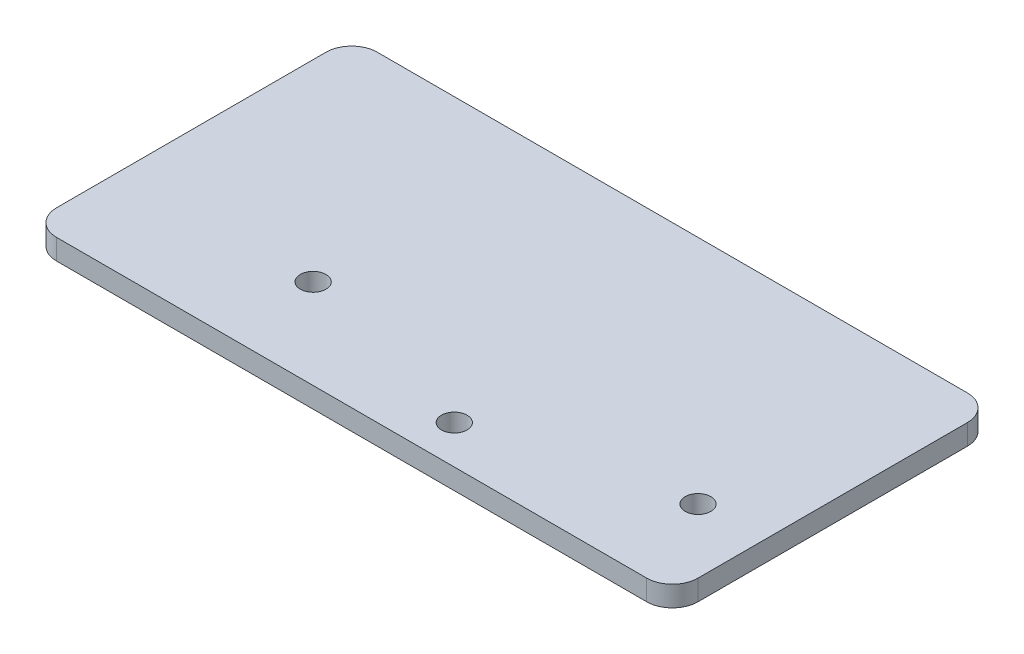
ISO-10303-21;
HEADER;
FILE_DESCRIPTION(('STEP AP214'),'2;1');
FILE_NAME('part.step','',(''),(''),'','','');
FILE_SCHEMA(('AUTOMOTIVE_DESIGN { 1 0 10303 214 1 1 1 1 }'));
ENDSEC;
DATA;
#1=APPLICATION_CONTEXT('core data for automotive mechanical design processes');
#2=APPLICATION_PROTOCOL_DEFINITION('international standard','automotive_design',2000,#1);
#3=PRODUCT_CONTEXT('',#1,'mechanical');
#4=PRODUCT('Part','Part','',(#3));
#5=PRODUCT_RELATED_PRODUCT_CATEGORY('part','',(#4));
#6=PRODUCT_DEFINITION_FORMATION('','',#4);
#7=PRODUCT_DEFINITION_CONTEXT('part definition',#1,'design');
#8=PRODUCT_DEFINITION('design','',#6,#7);
#9=PRODUCT_DEFINITION_SHAPE('','',#8);
#10=(LENGTH_UNIT() NAMED_UNIT(*) SI_UNIT(.MILLI.,.METRE.));
#11=(NAMED_UNIT(*) PLANE_ANGLE_UNIT() SI_UNIT($,.RADIAN.));
#12=(NAMED_UNIT(*) SI_UNIT($,.STERADIAN.) SOLID_ANGLE_UNIT());
#13=UNCERTAINTY_MEASURE_WITH_UNIT(LENGTH_MEASURE(1.E-05),#10,'distance_accuracy_value','');
#14=(GEOMETRIC_REPRESENTATION_CONTEXT(3) GLOBAL_UNCERTAINTY_ASSIGNED_CONTEXT((#13)) GLOBAL_UNIT_ASSIGNED_CONTEXT((#10,
#11,#12)) REPRESENTATION_CONTEXT('',''));
#15=CARTESIAN_POINT('',(0.,0.,0.));
#16=DIRECTION('',(0.,0.,1.));
#17=DIRECTION('',(1.,0.,0.));
#18=AXIS2_PLACEMENT_3D('',#15,#16,#17);
#19=CARTESIAN_POINT('',(0.,1.6,0.));
#20=DIRECTION('',(0.,-1.,0.));
#21=DIRECTION('',(0.,0.,-1.));
#22=AXIS2_PLACEMENT_3D('',#19,#20,#21);
#23=PLANE('',#22);
#24=DIRECTION('',(-1.,0.,0.));
#25=VECTOR('',#24,1.);
#26=CARTESIAN_POINT('',(-25.,1.6,-12.5));
#27=LINE('',#26,#25);
#28=CARTESIAN_POINT('',(23.,1.6,-12.5));
#29=VERTEX_POINT('',#28);
#30=CARTESIAN_POINT('',(-23.,1.6,-12.5));
#31=VERTEX_POINT('',#30);
#32=EDGE_CURVE('E178',#29,#31,#27,.T.);
#33=ORIENTED_EDGE('',*,*,#32,.T.);
#34=CARTESIAN_POINT('',(-23.,1.6,-10.5));
#35=DIRECTION('',(0.,-1.,0.));
#36=DIRECTION('',(0.,0.,-1.));
#37=AXIS2_PLACEMENT_3D('',#34,#35,#36);
#38=CIRCLE('',#37,2.);
#39=CARTESIAN_POINT('',(-25.,1.6,-10.5));
#40=VERTEX_POINT('',#39);
#41=EDGE_CURVE('E155',#31,#40,#38,.F.);
#42=ORIENTED_EDGE('',*,*,#41,.T.);
#43=DIRECTION('',(0.,0.,1.));
#44=VECTOR('',#43,1.);
#45=CARTESIAN_POINT('',(-25.,1.6,12.5));
#46=LINE('',#45,#44);
#47=CARTESIAN_POINT('',(-25.,1.6,10.5));
#48=VERTEX_POINT('',#47);
#49=EDGE_CURVE('E125',#40,#48,#46,.T.);
#50=ORIENTED_EDGE('',*,*,#49,.T.);
#51=CARTESIAN_POINT('',(-23.,1.6,10.5));
#52=DIRECTION('',(0.,-1.,0.));
#53=DIRECTION('',(0.,0.,-1.));
#54=AXIS2_PLACEMENT_3D('',#51,#52,#53);
#55=CIRCLE('',#54,2.);
#56=CARTESIAN_POINT('',(-23.,1.6,12.5));
#57=VERTEX_POINT('',#56);
#58=EDGE_CURVE('E62',#48,#57,#55,.F.);
#59=ORIENTED_EDGE('',*,*,#58,.T.);
#60=DIRECTION('',(1.,0.,0.));
#61=VECTOR('',#60,1.);
#62=CARTESIAN_POINT('',(-25.,1.6,12.5));
#63=LINE('',#62,#61);
#64=CARTESIAN_POINT('',(23.,1.6,12.5));
#65=VERTEX_POINT('',#64);
#66=EDGE_CURVE('E141',#57,#65,#63,.T.);
#67=ORIENTED_EDGE('',*,*,#66,.T.);
#68=CARTESIAN_POINT('',(23.,1.6,10.5));
#69=DIRECTION('',(0.,-1.,0.));
#70=DIRECTION('',(0.,0.,-1.));
#71=AXIS2_PLACEMENT_3D('',#68,#69,#70);
#72=CIRCLE('',#71,2.);
#73=CARTESIAN_POINT('',(25.,1.6,10.5));
#74=VERTEX_POINT('',#73);
#75=EDGE_CURVE('E150',#65,#74,#72,.F.);
#76=ORIENTED_EDGE('',*,*,#75,.T.);
#77=DIRECTION('',(0.,0.,-1.));
#78=VECTOR('',#77,1.);
#79=CARTESIAN_POINT('',(25.,1.6,12.5));
#80=LINE('',#79,#78);
#81=CARTESIAN_POINT('',(25.,1.6,-10.5));
#82=VERTEX_POINT('',#81);
#83=EDGE_CURVE('E135',#74,#82,#80,.T.);
#84=ORIENTED_EDGE('',*,*,#83,.T.);
#85=CARTESIAN_POINT('',(23.,1.6,-10.5));
#86=DIRECTION('',(0.,-1.,0.));
#87=DIRECTION('',(0.,0.,-1.));
#88=AXIS2_PLACEMENT_3D('',#85,#86,#87);
#89=CIRCLE('',#88,2.);
#90=EDGE_CURVE('E152',#82,#29,#89,.F.);
#91=ORIENTED_EDGE('',*,*,#90,.T.);
#92=EDGE_LOOP('',(#33,#42,#50,#59,#67,#76,#84,#91));
#93=FACE_BOUND('',#92,.T.);
#94=CARTESIAN_POINT('',(-10.,1.6,5.5));
#95=DIRECTION('',(0.,1.,0.));
#96=DIRECTION('',(0.,0.,1.));
#97=AXIS2_PLACEMENT_3D('',#94,#95,#96);
#98=CIRCLE('',#97,1.);
#99=CARTESIAN_POINT('',(-10.,1.6,6.5));
#100=VERTEX_POINT('',#99);
#101=EDGE_CURVE('E171',#100,#100,#98,.T.);
#102=ORIENTED_EDGE('',*,*,#101,.F.);
#103=EDGE_LOOP('',(#102));
#104=FACE_BOUND('',#103,.T.);
#105=CARTESIAN_POINT('',(20.,1.6,5.5));
#106=DIRECTION('',(0.,1.,0.));
#107=DIRECTION('',(0.,0.,1.));
#108=AXIS2_PLACEMENT_3D('',#105,#106,#107);
#109=CIRCLE('',#108,1.);
#110=CARTESIAN_POINT('',(20.,1.6,6.5));
#111=VERTEX_POINT('',#110);
#112=EDGE_CURVE('E183',#111,#111,#109,.T.);
#113=ORIENTED_EDGE('',*,*,#112,.F.);
#114=EDGE_LOOP('',(#113));
#115=FACE_BOUND('',#114,.T.);
#116=CARTESIAN_POINT('',(5.,1.6,9.5));
#117=DIRECTION('',(0.,1.,0.));
#118=DIRECTION('',(0.,0.,1.));
#119=AXIS2_PLACEMENT_3D('',#116,#117,#118);
#120=CIRCLE('',#119,1.);
#121=CARTESIAN_POINT('',(5.,1.6,10.5));
#122=VERTEX_POINT('',#121);
#123=EDGE_CURVE('E188',#122,#122,#120,.T.);
#124=ORIENTED_EDGE('',*,*,#123,.F.);
#125=EDGE_LOOP('',(#124));
#126=FACE_BOUND('',#125,.T.);
#127=ADVANCED_FACE('F40',(#93,#104,#115,#126),#23,.F.);
#128=CARTESIAN_POINT('',(0.,0.,0.));
#129=DIRECTION('',(0.,-1.,0.));
#130=DIRECTION('',(0.,0.,-1.));
#131=AXIS2_PLACEMENT_3D('',#128,#129,#130);
#132=PLANE('',#131);
#133=CARTESIAN_POINT('',(20.,0.,5.5));
#134=DIRECTION('',(0.,1.,0.));
#135=DIRECTION('',(0.,0.,1.));
#136=AXIS2_PLACEMENT_3D('',#133,#134,#135);
#137=CIRCLE('',#136,1.);
#138=CARTESIAN_POINT('',(20.,0.,6.5));
#139=VERTEX_POINT('',#138);
#140=EDGE_CURVE('E185',#139,#139,#137,.T.);
#141=ORIENTED_EDGE('',*,*,#140,.T.);
#142=EDGE_LOOP('',(#141));
#143=FACE_BOUND('',#142,.T.);
#144=DIRECTION('',(0.,0.,1.));
#145=VECTOR('',#144,1.);
#146=CARTESIAN_POINT('',(-25.,0.,12.5));
#147=LINE('',#146,#145);
#148=CARTESIAN_POINT('',(-25.,0.,-10.5));
#149=VERTEX_POINT('',#148);
#150=CARTESIAN_POINT('',(-25.,0.,10.5));
#151=VERTEX_POINT('',#150);
#152=EDGE_CURVE('E123',#149,#151,#147,.T.);
#153=ORIENTED_EDGE('',*,*,#152,.F.);
#154=CARTESIAN_POINT('',(-23.,0.,-10.5));
#155=DIRECTION('',(0.,-1.,0.));
#156=DIRECTION('',(0.,0.,-1.));
#157=AXIS2_PLACEMENT_3D('',#154,#155,#156);
#158=CIRCLE('',#157,2.);
#159=CARTESIAN_POINT('',(-23.,0.,-12.5));
#160=VERTEX_POINT('',#159);
#161=EDGE_CURVE('E106',#149,#160,#158,.T.);
#162=ORIENTED_EDGE('',*,*,#161,.T.);
#163=DIRECTION('',(-1.,0.,0.));
#164=VECTOR('',#163,1.);
#165=CARTESIAN_POINT('',(-25.,0.,-12.5));
#166=LINE('',#165,#164);
#167=CARTESIAN_POINT('',(23.,0.,-12.5));
#168=VERTEX_POINT('',#167);
#169=EDGE_CURVE('E133',#168,#160,#166,.T.);
#170=ORIENTED_EDGE('',*,*,#169,.F.);
#171=CARTESIAN_POINT('',(23.,0.,-10.5));
#172=DIRECTION('',(0.,-1.,0.));
#173=DIRECTION('',(0.,0.,-1.));
#174=AXIS2_PLACEMENT_3D('',#171,#172,#173);
#175=CIRCLE('',#174,2.);
#176=CARTESIAN_POINT('',(25.,0.,-10.5));
#177=VERTEX_POINT('',#176);
#178=EDGE_CURVE('E144',#168,#177,#175,.T.);
#179=ORIENTED_EDGE('',*,*,#178,.T.);
#180=DIRECTION('',(0.,0.,-1.));
#181=VECTOR('',#180,1.);
#182=CARTESIAN_POINT('',(25.,0.,12.5));
#183=LINE('',#182,#181);
#184=CARTESIAN_POINT('',(25.,0.,10.5));
#185=VERTEX_POINT('',#184);
#186=EDGE_CURVE('E137',#185,#177,#183,.T.);
#187=ORIENTED_EDGE('',*,*,#186,.F.);
#188=CARTESIAN_POINT('',(23.,0.,10.5));
#189=DIRECTION('',(0.,-1.,0.));
#190=DIRECTION('',(0.,0.,-1.));
#191=AXIS2_PLACEMENT_3D('',#188,#189,#190);
#192=CIRCLE('',#191,2.);
#193=CARTESIAN_POINT('',(23.,0.,12.5));
#194=VERTEX_POINT('',#193);
#195=EDGE_CURVE('E126',#185,#194,#192,.T.);
#196=ORIENTED_EDGE('',*,*,#195,.T.);
#197=DIRECTION('',(1.,0.,0.));
#198=VECTOR('',#197,1.);
#199=CARTESIAN_POINT('',(-25.,0.,12.5));
#200=LINE('',#199,#198);
#201=CARTESIAN_POINT('',(-23.,0.,12.5));
#202=VERTEX_POINT('',#201);
#203=EDGE_CURVE('E132',#202,#194,#200,.T.);
#204=ORIENTED_EDGE('',*,*,#203,.F.);
#205=CARTESIAN_POINT('',(-23.,0.,10.5));
#206=DIRECTION('',(0.,-1.,0.));
#207=DIRECTION('',(0.,0.,-1.));
#208=AXIS2_PLACEMENT_3D('',#205,#206,#207);
#209=CIRCLE('',#208,2.);
#210=EDGE_CURVE('E117',#202,#151,#209,.T.);
#211=ORIENTED_EDGE('',*,*,#210,.T.);
#212=EDGE_LOOP('',(#153,#162,#170,#179,#187,#196,#204,#211));
#213=FACE_BOUND('',#212,.T.);
#214=CARTESIAN_POINT('',(-10.,0.,5.5));
#215=DIRECTION('',(0.,1.,0.));
#216=DIRECTION('',(0.,0.,1.));
#217=AXIS2_PLACEMENT_3D('',#214,#215,#216);
#218=CIRCLE('',#217,1.);
#219=CARTESIAN_POINT('',(-10.,0.,6.5));
#220=VERTEX_POINT('',#219);
#221=EDGE_CURVE('E173',#220,#220,#218,.T.);
#222=ORIENTED_EDGE('',*,*,#221,.T.);
#223=EDGE_LOOP('',(#222));
#224=FACE_BOUND('',#223,.T.);
#225=CARTESIAN_POINT('',(5.,0.,9.5));
#226=DIRECTION('',(0.,1.,0.));
#227=DIRECTION('',(0.,0.,1.));
#228=AXIS2_PLACEMENT_3D('',#225,#226,#227);
#229=CIRCLE('',#228,1.);
#230=CARTESIAN_POINT('',(5.,0.,10.5));
#231=VERTEX_POINT('',#230);
#232=EDGE_CURVE('E191',#231,#231,#229,.T.);
#233=ORIENTED_EDGE('',*,*,#232,.T.);
#234=EDGE_LOOP('',(#233));
#235=FACE_BOUND('',#234,.T.);
#236=ADVANCED_FACE('F129',(#143,#213,#224,#235),#132,.T.);
#237=CARTESIAN_POINT('',(25.,1.6,12.5));
#238=DIRECTION('',(-1.,0.,0.));
#239=DIRECTION('',(0.,0.,1.));
#240=AXIS2_PLACEMENT_3D('',#237,#238,#239);
#241=PLANE('',#240);
#242=ORIENTED_EDGE('',*,*,#186,.T.);
#243=DIRECTION('',(0.,-1.,0.));
#244=VECTOR('',#243,1.);
#245=CARTESIAN_POINT('',(25.,1.6,-10.5));
#246=LINE('',#245,#244);
#247=EDGE_CURVE('E11',#177,#82,#246,.F.);
#248=ORIENTED_EDGE('',*,*,#247,.T.);
#249=ORIENTED_EDGE('',*,*,#83,.F.);
#250=DIRECTION('',(0.,-1.,0.));
#251=VECTOR('',#250,1.);
#252=CARTESIAN_POINT('',(25.,1.6,10.5));
#253=LINE('',#252,#251);
#254=EDGE_CURVE('E48',#74,#185,#253,.T.);
#255=ORIENTED_EDGE('',*,*,#254,.T.);
#256=EDGE_LOOP('',(#242,#248,#249,#255));
#257=FACE_BOUND('',#256,.T.);
#258=ADVANCED_FACE('F166',(#257),#241,.F.);
#259=CARTESIAN_POINT('',(-25.,1.6,-12.5));
#260=DIRECTION('',(0.,0.,1.));
#261=DIRECTION('',(1.,0.,0.));
#262=AXIS2_PLACEMENT_3D('',#259,#260,#261);
#263=PLANE('',#262);
#264=ORIENTED_EDGE('',*,*,#169,.T.);
#265=DIRECTION('',(0.,-1.,0.));
#266=VECTOR('',#265,1.);
#267=CARTESIAN_POINT('',(-23.,1.6,-12.5));
#268=LINE('',#267,#266);
#269=EDGE_CURVE('E111',#160,#31,#268,.F.);
#270=ORIENTED_EDGE('',*,*,#269,.T.);
#271=ORIENTED_EDGE('',*,*,#32,.F.);
#272=DIRECTION('',(0.,-1.,0.));
#273=VECTOR('',#272,1.);
#274=CARTESIAN_POINT('',(23.,1.6,-12.5));
#275=LINE('',#274,#273);
#276=EDGE_CURVE('E116',#29,#168,#275,.T.);
#277=ORIENTED_EDGE('',*,*,#276,.T.);
#278=EDGE_LOOP('',(#264,#270,#271,#277));
#279=FACE_BOUND('',#278,.T.);
#280=ADVANCED_FACE('F217',(#279),#263,.F.);
#281=CARTESIAN_POINT('',(-25.,1.6,12.5));
#282=DIRECTION('',(1.,0.,0.));
#283=DIRECTION('',(0.,0.,-1.));
#284=AXIS2_PLACEMENT_3D('',#281,#282,#283);
#285=PLANE('',#284);
#286=ORIENTED_EDGE('',*,*,#49,.F.);
#287=DIRECTION('',(0.,-1.,0.));
#288=VECTOR('',#287,1.);
#289=CARTESIAN_POINT('',(-25.,1.6,-10.5));
#290=LINE('',#289,#288);
#291=EDGE_CURVE('E110',#40,#149,#290,.T.);
#292=ORIENTED_EDGE('',*,*,#291,.T.);
#293=ORIENTED_EDGE('',*,*,#152,.T.);
#294=DIRECTION('',(0.,-1.,0.));
#295=VECTOR('',#294,1.);
#296=CARTESIAN_POINT('',(-25.,1.6,10.5));
#297=LINE('',#296,#295);
#298=EDGE_CURVE('E127',#151,#48,#297,.F.);
#299=ORIENTED_EDGE('',*,*,#298,.T.);
#300=EDGE_LOOP('',(#286,#292,#293,#299));
#301=FACE_BOUND('',#300,.T.);
#302=ADVANCED_FACE('F122',(#301),#285,.F.);
#303=CARTESIAN_POINT('',(-25.,1.6,12.5));
#304=DIRECTION('',(0.,0.,-1.));
#305=DIRECTION('',(-1.,0.,0.));
#306=AXIS2_PLACEMENT_3D('',#303,#304,#305);
#307=PLANE('',#306);
#308=ORIENTED_EDGE('',*,*,#66,.F.);
#309=DIRECTION('',(0.,-1.,0.));
#310=VECTOR('',#309,1.);
#311=CARTESIAN_POINT('',(-23.,1.6,12.5));
#312=LINE('',#311,#310);
#313=EDGE_CURVE('E158',#57,#202,#312,.T.);
#314=ORIENTED_EDGE('',*,*,#313,.T.);
#315=ORIENTED_EDGE('',*,*,#203,.T.);
#316=DIRECTION('',(0.,-1.,0.));
#317=VECTOR('',#316,1.);
#318=CARTESIAN_POINT('',(23.,1.6,12.5));
#319=LINE('',#318,#317);
#320=EDGE_CURVE('E55',#194,#65,#319,.F.);
#321=ORIENTED_EDGE('',*,*,#320,.T.);
#322=EDGE_LOOP('',(#308,#314,#315,#321));
#323=FACE_BOUND('',#322,.T.);
#324=ADVANCED_FACE('F212',(#323),#307,.F.);
#325=CARTESIAN_POINT('',(-10.,1.6,5.5));
#326=DIRECTION('',(0.,-1.,0.));
#327=DIRECTION('',(0.,0.,-1.));
#328=AXIS2_PLACEMENT_3D('',#325,#326,#327);
#329=CYLINDRICAL_SURFACE('',#328,1.);
#330=ORIENTED_EDGE('',*,*,#101,.T.);
#331=EDGE_LOOP('',(#330));
#332=FACE_BOUND('',#331,.T.);
#333=ORIENTED_EDGE('',*,*,#221,.F.);
#334=EDGE_LOOP('',(#333));
#335=FACE_BOUND('',#334,.T.);
#336=ADVANCED_FACE('F209',(#332,#335),#329,.F.);
#337=CARTESIAN_POINT('',(20.,1.6,5.5));
#338=DIRECTION('',(0.,-1.,0.));
#339=DIRECTION('',(0.,0.,-1.));
#340=AXIS2_PLACEMENT_3D('',#337,#338,#339);
#341=CYLINDRICAL_SURFACE('',#340,1.);
#342=ORIENTED_EDGE('',*,*,#112,.T.);
#343=EDGE_LOOP('',(#342));
#344=FACE_BOUND('',#343,.T.);
#345=ORIENTED_EDGE('',*,*,#140,.F.);
#346=EDGE_LOOP('',(#345));
#347=FACE_BOUND('',#346,.T.);
#348=ADVANCED_FACE('F311',(#344,#347),#341,.F.);
#349=CARTESIAN_POINT('',(5.,1.6,9.5));
#350=DIRECTION('',(0.,-1.,0.));
#351=DIRECTION('',(0.,0.,-1.));
#352=AXIS2_PLACEMENT_3D('',#349,#350,#351);
#353=CYLINDRICAL_SURFACE('',#352,1.);
#354=ORIENTED_EDGE('',*,*,#123,.T.);
#355=EDGE_LOOP('',(#354));
#356=FACE_BOUND('',#355,.T.);
#357=ORIENTED_EDGE('',*,*,#232,.F.);
#358=EDGE_LOOP('',(#357));
#359=FACE_BOUND('',#358,.T.);
#360=ADVANCED_FACE('F197',(#356,#359),#353,.F.);
#361=CARTESIAN_POINT('',(-23.,1.6,-10.5));
#362=DIRECTION('',(0.,-1.,0.));
#363=DIRECTION('',(0.,0.,-1.));
#364=AXIS2_PLACEMENT_3D('',#361,#362,#363);
#365=CYLINDRICAL_SURFACE('',#364,2.);
#366=ORIENTED_EDGE('',*,*,#41,.F.);
#367=ORIENTED_EDGE('',*,*,#269,.F.);
#368=ORIENTED_EDGE('',*,*,#161,.F.);
#369=ORIENTED_EDGE('',*,*,#291,.F.);
#370=EDGE_LOOP('',(#366,#367,#368,#369));
#371=FACE_BOUND('',#370,.T.);
#372=ADVANCED_FACE('F109',(#371),#365,.T.);
#373=CARTESIAN_POINT('',(-23.,1.6,10.5));
#374=DIRECTION('',(0.,-1.,0.));
#375=DIRECTION('',(0.,0.,-1.));
#376=AXIS2_PLACEMENT_3D('',#373,#374,#375);
#377=CYLINDRICAL_SURFACE('',#376,2.);
#378=ORIENTED_EDGE('',*,*,#58,.F.);
#379=ORIENTED_EDGE('',*,*,#298,.F.);
#380=ORIENTED_EDGE('',*,*,#210,.F.);
#381=ORIENTED_EDGE('',*,*,#313,.F.);
#382=EDGE_LOOP('',(#378,#379,#380,#381));
#383=FACE_BOUND('',#382,.T.);
#384=ADVANCED_FACE('F225',(#383),#377,.T.);
#385=CARTESIAN_POINT('',(23.,1.6,-10.5));
#386=DIRECTION('',(0.,-1.,0.));
#387=DIRECTION('',(0.,0.,-1.));
#388=AXIS2_PLACEMENT_3D('',#385,#386,#387);
#389=CYLINDRICAL_SURFACE('',#388,2.);
#390=ORIENTED_EDGE('',*,*,#90,.F.);
#391=ORIENTED_EDGE('',*,*,#247,.F.);
#392=ORIENTED_EDGE('',*,*,#178,.F.);
#393=ORIENTED_EDGE('',*,*,#276,.F.);
#394=EDGE_LOOP('',(#390,#391,#392,#393));
#395=FACE_BOUND('',#394,.T.);
#396=ADVANCED_FACE('F227',(#395),#389,.T.);
#397=CARTESIAN_POINT('',(23.,1.6,10.5));
#398=DIRECTION('',(0.,-1.,0.));
#399=DIRECTION('',(0.,0.,-1.));
#400=AXIS2_PLACEMENT_3D('',#397,#398,#399);
#401=CYLINDRICAL_SURFACE('',#400,2.);
#402=ORIENTED_EDGE('',*,*,#75,.F.);
#403=ORIENTED_EDGE('',*,*,#320,.F.);
#404=ORIENTED_EDGE('',*,*,#195,.F.);
#405=ORIENTED_EDGE('',*,*,#254,.F.);
#406=EDGE_LOOP('',(#402,#403,#404,#405));
#407=FACE_BOUND('',#406,.T.);
#408=ADVANCED_FACE('F42',(#407),#401,.T.);
#409=CLOSED_SHELL('',(#127,#236,#258,#280,#302,#324,#336,#348,#360,#372,#384,#396,#408));
#410=MANIFOLD_SOLID_BREP('B2',#409);
#411=ADVANCED_BREP_SHAPE_REPRESENTATION('',(#18,#410),#14);
#412=SHAPE_DEFINITION_REPRESENTATION(#9,#411);
ENDSEC;
END-ISO-10303-21;
